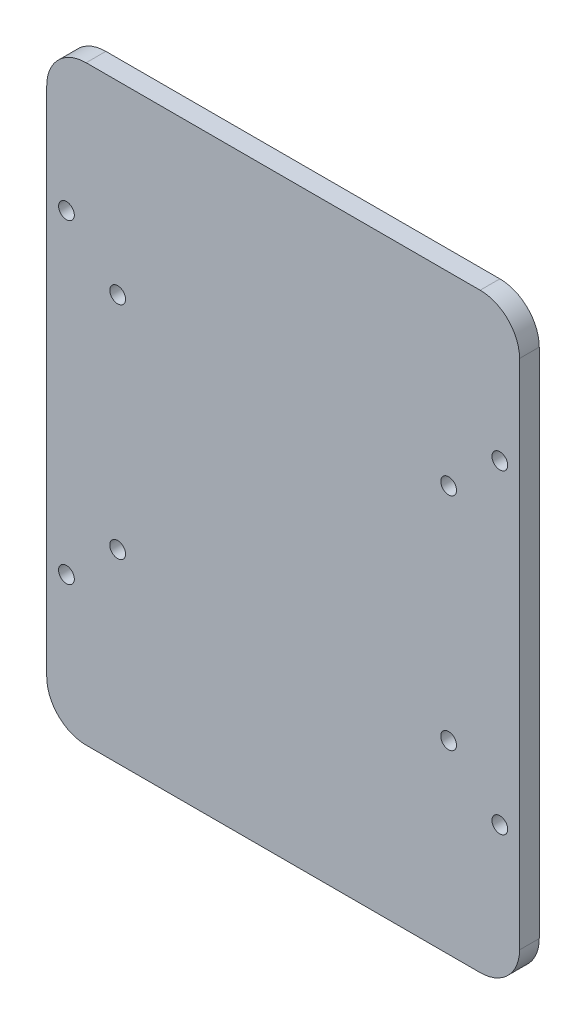
ISO-10303-21;
HEADER;
FILE_DESCRIPTION(('STEP AP214'),'2;1');
FILE_NAME('part.step','',(''),(''),'','','');
FILE_SCHEMA(('AUTOMOTIVE_DESIGN { 1 0 10303 214 1 1 1 1 }'));
ENDSEC;
DATA;
#1=APPLICATION_CONTEXT('core data for automotive mechanical design processes');
#2=APPLICATION_PROTOCOL_DEFINITION('international standard','automotive_design',2000,#1);
#3=PRODUCT_CONTEXT('',#1,'mechanical');
#4=PRODUCT('Part','Part','',(#3));
#5=PRODUCT_RELATED_PRODUCT_CATEGORY('part','',(#4));
#6=PRODUCT_DEFINITION_FORMATION('','',#4);
#7=PRODUCT_DEFINITION_CONTEXT('part definition',#1,'design');
#8=PRODUCT_DEFINITION('design','',#6,#7);
#9=PRODUCT_DEFINITION_SHAPE('','',#8);
#10=(LENGTH_UNIT() NAMED_UNIT(*) SI_UNIT(.MILLI.,.METRE.));
#11=(NAMED_UNIT(*) PLANE_ANGLE_UNIT() SI_UNIT($,.RADIAN.));
#12=(NAMED_UNIT(*) SI_UNIT($,.STERADIAN.) SOLID_ANGLE_UNIT());
#13=UNCERTAINTY_MEASURE_WITH_UNIT(LENGTH_MEASURE(1.E-05),#10,'distance_accuracy_value','');
#14=(GEOMETRIC_REPRESENTATION_CONTEXT(3) GLOBAL_UNCERTAINTY_ASSIGNED_CONTEXT((#13)) GLOBAL_UNIT_ASSIGNED_CONTEXT((#10,
#11,#12)) REPRESENTATION_CONTEXT('',''));
#15=CARTESIAN_POINT('',(0.,0.,0.));
#16=DIRECTION('',(0.,0.,1.));
#17=DIRECTION('',(1.,0.,0.));
#18=AXIS2_PLACEMENT_3D('',#15,#16,#17);
#19=CARTESIAN_POINT('',(120.,0.,5.));
#20=DIRECTION('',(0.,1.,0.));
#21=DIRECTION('',(-1.,0.,0.));
#22=AXIS2_PLACEMENT_3D('',#19,#20,#21);
#23=PLANE('',#22);
#24=DIRECTION('',(1.,0.,0.));
#25=VECTOR('',#24,1.);
#26=CARTESIAN_POINT('',(120.,0.,5.));
#27=LINE('',#26,#25);
#28=CARTESIAN_POINT('',(10.,0.,5.));
#29=VERTEX_POINT('',#28);
#30=CARTESIAN_POINT('',(110.,0.,5.));
#31=VERTEX_POINT('',#30);
#32=EDGE_CURVE('E122',#29,#31,#27,.T.);
#33=ORIENTED_EDGE('',*,*,#32,.F.);
#34=DIRECTION('',(0.,0.,-1.));
#35=VECTOR('',#34,1.);
#36=CARTESIAN_POINT('',(9.99999999999999,0.,5.));
#37=LINE('',#36,#35);
#38=CARTESIAN_POINT('',(10.,0.,0.));
#39=VERTEX_POINT('',#38);
#40=EDGE_CURVE('E107',#29,#39,#37,.T.);
#41=ORIENTED_EDGE('',*,*,#40,.T.);
#42=DIRECTION('',(1.,0.,0.));
#43=VECTOR('',#42,1.);
#44=CARTESIAN_POINT('',(120.,0.,0.));
#45=LINE('',#44,#43);
#46=CARTESIAN_POINT('',(110.,0.,0.));
#47=VERTEX_POINT('',#46);
#48=EDGE_CURVE('E119',#39,#47,#45,.T.);
#49=ORIENTED_EDGE('',*,*,#48,.T.);
#50=DIRECTION('',(0.,0.,-1.));
#51=VECTOR('',#50,1.);
#52=CARTESIAN_POINT('',(110.,0.,5.));
#53=LINE('',#52,#51);
#54=EDGE_CURVE('E124',#47,#31,#53,.F.);
#55=ORIENTED_EDGE('',*,*,#54,.T.);
#56=EDGE_LOOP('',(#33,#41,#49,#55));
#57=FACE_BOUND('',#56,.T.);
#58=ADVANCED_FACE('F35',(#57),#23,.F.);
#59=CARTESIAN_POINT('',(120.,150.,5.));
#60=DIRECTION('',(-1.,0.,0.));
#61=DIRECTION('',(0.,-1.,0.));
#62=AXIS2_PLACEMENT_3D('',#59,#60,#61);
#63=PLANE('',#62);
#64=DIRECTION('',(0.,1.,0.));
#65=VECTOR('',#64,1.);
#66=CARTESIAN_POINT('',(120.,150.,5.));
#67=LINE('',#66,#65);
#68=CARTESIAN_POINT('',(120.,10.,5.));
#69=VERTEX_POINT('',#68);
#70=CARTESIAN_POINT('',(120.,140.,5.));
#71=VERTEX_POINT('',#70);
#72=EDGE_CURVE('E211',#69,#71,#67,.T.);
#73=ORIENTED_EDGE('',*,*,#72,.F.);
#74=DIRECTION('',(0.,0.,-1.));
#75=VECTOR('',#74,1.);
#76=CARTESIAN_POINT('',(120.,10.,5.));
#77=LINE('',#76,#75);
#78=CARTESIAN_POINT('',(120.,10.,0.));
#79=VERTEX_POINT('',#78);
#80=EDGE_CURVE('E161',#69,#79,#77,.T.);
#81=ORIENTED_EDGE('',*,*,#80,.T.);
#82=DIRECTION('',(0.,1.,0.));
#83=VECTOR('',#82,1.);
#84=CARTESIAN_POINT('',(120.,150.,0.));
#85=LINE('',#84,#83);
#86=CARTESIAN_POINT('',(120.,140.,0.));
#87=VERTEX_POINT('',#86);
#88=EDGE_CURVE('E128',#79,#87,#85,.T.);
#89=ORIENTED_EDGE('',*,*,#88,.T.);
#90=DIRECTION('',(0.,0.,-1.));
#91=VECTOR('',#90,1.);
#92=CARTESIAN_POINT('',(120.,140.,5.));
#93=LINE('',#92,#91);
#94=EDGE_CURVE('E159',#87,#71,#93,.F.);
#95=ORIENTED_EDGE('',*,*,#94,.T.);
#96=EDGE_LOOP('',(#73,#81,#89,#95));
#97=FACE_BOUND('',#96,.T.);
#98=ADVANCED_FACE('F229',(#97),#63,.F.);
#99=CARTESIAN_POINT('',(0.,150.,5.));
#100=DIRECTION('',(0.,-1.,0.));
#101=DIRECTION('',(0.,0.,-1.));
#102=AXIS2_PLACEMENT_3D('',#99,#100,#101);
#103=PLANE('',#102);
#104=DIRECTION('',(-1.,0.,0.));
#105=VECTOR('',#104,1.);
#106=CARTESIAN_POINT('',(0.,150.,5.));
#107=LINE('',#106,#105);
#108=CARTESIAN_POINT('',(110.,150.,5.));
#109=VERTEX_POINT('',#108);
#110=CARTESIAN_POINT('',(10.,150.,5.));
#111=VERTEX_POINT('',#110);
#112=EDGE_CURVE('E212',#109,#111,#107,.T.);
#113=ORIENTED_EDGE('',*,*,#112,.F.);
#114=DIRECTION('',(0.,0.,-1.));
#115=VECTOR('',#114,1.);
#116=CARTESIAN_POINT('',(110.,150.,5.));
#117=LINE('',#116,#115);
#118=CARTESIAN_POINT('',(110.,150.,0.));
#119=VERTEX_POINT('',#118);
#120=EDGE_CURVE('E11',#109,#119,#117,.T.);
#121=ORIENTED_EDGE('',*,*,#120,.T.);
#122=DIRECTION('',(-1.,0.,0.));
#123=VECTOR('',#122,1.);
#124=CARTESIAN_POINT('',(0.,150.,0.));
#125=LINE('',#124,#123);
#126=CARTESIAN_POINT('',(10.,150.,0.));
#127=VERTEX_POINT('',#126);
#128=EDGE_CURVE('E132',#119,#127,#125,.T.);
#129=ORIENTED_EDGE('',*,*,#128,.T.);
#130=DIRECTION('',(0.,0.,-1.));
#131=VECTOR('',#130,1.);
#132=CARTESIAN_POINT('',(10.,150.,5.));
#133=LINE('',#132,#131);
#134=EDGE_CURVE('E44',#127,#111,#133,.F.);
#135=ORIENTED_EDGE('',*,*,#134,.T.);
#136=EDGE_LOOP('',(#113,#121,#129,#135));
#137=FACE_BOUND('',#136,.T.);
#138=ADVANCED_FACE('F222',(#137),#103,.F.);
#139=CARTESIAN_POINT('',(0.,0.,5.));
#140=DIRECTION('',(1.,0.,0.));
#141=DIRECTION('',(0.,0.,-1.));
#142=AXIS2_PLACEMENT_3D('',#139,#140,#141);
#143=PLANE('',#142);
#144=DIRECTION('',(0.,-1.,0.));
#145=VECTOR('',#144,1.);
#146=CARTESIAN_POINT('',(0.,0.,0.));
#147=LINE('',#146,#145);
#148=CARTESIAN_POINT('',(0.,140.,0.));
#149=VERTEX_POINT('',#148);
#150=CARTESIAN_POINT('',(0.,10.,0.));
#151=VERTEX_POINT('',#150);
#152=EDGE_CURVE('E142',#149,#151,#147,.T.);
#153=ORIENTED_EDGE('',*,*,#152,.T.);
#154=DIRECTION('',(0.,0.,-1.));
#155=VECTOR('',#154,1.);
#156=CARTESIAN_POINT('',(0.,10.,5.));
#157=LINE('',#156,#155);
#158=CARTESIAN_POINT('',(0.,10.,5.));
#159=VERTEX_POINT('',#158);
#160=EDGE_CURVE('E108',#151,#159,#157,.F.);
#161=ORIENTED_EDGE('',*,*,#160,.T.);
#162=DIRECTION('',(0.,-1.,0.));
#163=VECTOR('',#162,1.);
#164=CARTESIAN_POINT('',(0.,0.,5.));
#165=LINE('',#164,#163);
#166=CARTESIAN_POINT('',(0.,140.,5.));
#167=VERTEX_POINT('',#166);
#168=EDGE_CURVE('E138',#167,#159,#165,.T.);
#169=ORIENTED_EDGE('',*,*,#168,.F.);
#170=DIRECTION('',(0.,0.,-1.));
#171=VECTOR('',#170,1.);
#172=CARTESIAN_POINT('',(0.,140.,5.));
#173=LINE('',#172,#171);
#174=EDGE_CURVE('E113',#167,#149,#173,.T.);
#175=ORIENTED_EDGE('',*,*,#174,.T.);
#176=EDGE_LOOP('',(#153,#161,#169,#175));
#177=FACE_BOUND('',#176,.T.);
#178=ADVANCED_FACE('F219',(#177),#143,.F.);
#179=CARTESIAN_POINT('',(0.,0.,5.));
#180=DIRECTION('',(0.,0.,-1.));
#181=DIRECTION('',(-1.,0.,0.));
#182=AXIS2_PLACEMENT_3D('',#179,#180,#181);
#183=PLANE('',#182);
#184=CARTESIAN_POINT('',(102.,47.,5.));
#185=DIRECTION('',(0.,0.,-1.));
#186=DIRECTION('',(-1.,0.,0.));
#187=AXIS2_PLACEMENT_3D('',#184,#185,#186);
#188=CIRCLE('',#187,2.00000000000001);
#189=CARTESIAN_POINT('',(100.,47.,5.));
#190=VERTEX_POINT('',#189);
#191=EDGE_CURVE('E185',#190,#190,#188,.T.);
#192=ORIENTED_EDGE('',*,*,#191,.T.);
#193=EDGE_LOOP('',(#192));
#194=FACE_BOUND('',#193,.T.);
#195=CARTESIAN_POINT('',(115.,35.,5.));
#196=DIRECTION('',(0.,0.,-1.));
#197=DIRECTION('',(-1.,0.,0.));
#198=AXIS2_PLACEMENT_3D('',#195,#196,#197);
#199=CIRCLE('',#198,2.);
#200=CARTESIAN_POINT('',(113.,35.,5.));
#201=VERTEX_POINT('',#200);
#202=EDGE_CURVE('E191',#201,#201,#199,.T.);
#203=ORIENTED_EDGE('',*,*,#202,.T.);
#204=EDGE_LOOP('',(#203));
#205=FACE_BOUND('',#204,.T.);
#206=CARTESIAN_POINT('',(102.,103.,5.));
#207=DIRECTION('',(0.,0.,1.));
#208=DIRECTION('',(-1.,0.,0.));
#209=AXIS2_PLACEMENT_3D('',#206,#207,#208);
#210=CIRCLE('',#209,2.00000000000001);
#211=CARTESIAN_POINT('',(100.,103.,5.));
#212=VERTEX_POINT('',#211);
#213=EDGE_CURVE('E180',#212,#212,#210,.T.);
#214=ORIENTED_EDGE('',*,*,#213,.F.);
#215=EDGE_LOOP('',(#214));
#216=FACE_BOUND('',#215,.T.);
#217=CARTESIAN_POINT('',(115.,115.,5.));
#218=DIRECTION('',(0.,0.,1.));
#219=DIRECTION('',(-1.,0.,0.));
#220=AXIS2_PLACEMENT_3D('',#217,#218,#219);
#221=CIRCLE('',#220,2.);
#222=CARTESIAN_POINT('',(113.,115.,5.));
#223=VERTEX_POINT('',#222);
#224=EDGE_CURVE('E189',#223,#223,#221,.T.);
#225=ORIENTED_EDGE('',*,*,#224,.F.);
#226=EDGE_LOOP('',(#225));
#227=FACE_BOUND('',#226,.T.);
#228=CARTESIAN_POINT('',(18.,103.,5.));
#229=DIRECTION('',(0.,0.,-1.));
#230=DIRECTION('',(1.,0.,0.));
#231=AXIS2_PLACEMENT_3D('',#228,#229,#230);
#232=CIRCLE('',#231,2.00000000000001);
#233=CARTESIAN_POINT('',(20.,103.,5.));
#234=VERTEX_POINT('',#233);
#235=EDGE_CURVE('E172',#234,#234,#232,.T.);
#236=ORIENTED_EDGE('',*,*,#235,.T.);
#237=EDGE_LOOP('',(#236));
#238=FACE_BOUND('',#237,.T.);
#239=CARTESIAN_POINT('',(5.,115.,5.));
#240=DIRECTION('',(0.,0.,-1.));
#241=DIRECTION('',(1.,0.,0.));
#242=AXIS2_PLACEMENT_3D('',#239,#240,#241);
#243=CIRCLE('',#242,2.);
#244=CARTESIAN_POINT('',(7.,115.,5.));
#245=VERTEX_POINT('',#244);
#246=EDGE_CURVE('E182',#245,#245,#243,.T.);
#247=ORIENTED_EDGE('',*,*,#246,.T.);
#248=EDGE_LOOP('',(#247));
#249=FACE_BOUND('',#248,.T.);
#250=CARTESIAN_POINT('',(18.,47.,5.));
#251=DIRECTION('',(0.,0.,1.));
#252=DIRECTION('',(1.,0.,0.));
#253=AXIS2_PLACEMENT_3D('',#250,#251,#252);
#254=CIRCLE('',#253,2.00000000000001);
#255=CARTESIAN_POINT('',(20.,47.,5.));
#256=VERTEX_POINT('',#255);
#257=EDGE_CURVE('E166',#256,#256,#254,.T.);
#258=ORIENTED_EDGE('',*,*,#257,.F.);
#259=EDGE_LOOP('',(#258));
#260=FACE_BOUND('',#259,.T.);
#261=CARTESIAN_POINT('',(5.,35.,5.));
#262=DIRECTION('',(0.,0.,1.));
#263=DIRECTION('',(1.,0.,0.));
#264=AXIS2_PLACEMENT_3D('',#261,#262,#263);
#265=CIRCLE('',#264,2.);
#266=CARTESIAN_POINT('',(7.,35.,5.));
#267=VERTEX_POINT('',#266);
#268=EDGE_CURVE('E175',#267,#267,#265,.T.);
#269=ORIENTED_EDGE('',*,*,#268,.F.);
#270=EDGE_LOOP('',(#269));
#271=FACE_BOUND('',#270,.T.);
#272=ORIENTED_EDGE('',*,*,#168,.T.);
#273=CARTESIAN_POINT('',(9.99999999999999,10.,5.));
#274=DIRECTION('',(0.,0.,-1.));
#275=DIRECTION('',(-1.,0.,0.));
#276=AXIS2_PLACEMENT_3D('',#273,#274,#275);
#277=CIRCLE('',#276,10.);
#278=EDGE_CURVE('E157',#159,#29,#277,.F.);
#279=ORIENTED_EDGE('',*,*,#278,.T.);
#280=ORIENTED_EDGE('',*,*,#32,.T.);
#281=CARTESIAN_POINT('',(110.,10.,5.));
#282=DIRECTION('',(0.,0.,-1.));
#283=DIRECTION('',(-1.,0.,0.));
#284=AXIS2_PLACEMENT_3D('',#281,#282,#283);
#285=CIRCLE('',#284,10.);
#286=EDGE_CURVE('E155',#31,#69,#285,.F.);
#287=ORIENTED_EDGE('',*,*,#286,.T.);
#288=ORIENTED_EDGE('',*,*,#72,.T.);
#289=CARTESIAN_POINT('',(110.,140.,5.));
#290=DIRECTION('',(0.,0.,-1.));
#291=DIRECTION('',(-1.,0.,0.));
#292=AXIS2_PLACEMENT_3D('',#289,#290,#291);
#293=CIRCLE('',#292,10.);
#294=EDGE_CURVE('E58',#71,#109,#293,.F.);
#295=ORIENTED_EDGE('',*,*,#294,.T.);
#296=ORIENTED_EDGE('',*,*,#112,.T.);
#297=CARTESIAN_POINT('',(10.,140.,5.));
#298=DIRECTION('',(0.,0.,-1.));
#299=DIRECTION('',(-1.,0.,0.));
#300=AXIS2_PLACEMENT_3D('',#297,#298,#299);
#301=CIRCLE('',#300,10.);
#302=EDGE_CURVE('E152',#111,#167,#301,.F.);
#303=ORIENTED_EDGE('',*,*,#302,.T.);
#304=EDGE_LOOP('',(#272,#279,#280,#287,#288,#295,#296,#303));
#305=FACE_BOUND('',#304,.T.);
#306=ADVANCED_FACE('F216',(#194,#205,#216,#227,#238,#249,#260,#271,#305),#183,.F.);
#307=CARTESIAN_POINT('',(0.,0.,0.));
#308=DIRECTION('',(0.,0.,-1.));
#309=DIRECTION('',(-1.,0.,0.));
#310=AXIS2_PLACEMENT_3D('',#307,#308,#309);
#311=PLANE('',#310);
#312=CARTESIAN_POINT('',(102.,47.,0.));
#313=DIRECTION('',(0.,0.,-1.));
#314=DIRECTION('',(-1.,0.,0.));
#315=AXIS2_PLACEMENT_3D('',#312,#313,#314);
#316=CIRCLE('',#315,2.00000000000001);
#317=CARTESIAN_POINT('',(100.,47.,0.));
#318=VERTEX_POINT('',#317);
#319=EDGE_CURVE('E39',#318,#318,#316,.F.);
#320=ORIENTED_EDGE('',*,*,#319,.T.);
#321=EDGE_LOOP('',(#320));
#322=FACE_BOUND('',#321,.T.);
#323=CARTESIAN_POINT('',(115.,35.,0.));
#324=DIRECTION('',(0.,0.,-1.));
#325=DIRECTION('',(-1.,0.,0.));
#326=AXIS2_PLACEMENT_3D('',#323,#324,#325);
#327=CIRCLE('',#326,2.);
#328=CARTESIAN_POINT('',(113.,35.,0.));
#329=VERTEX_POINT('',#328);
#330=EDGE_CURVE('E183',#329,#329,#327,.F.);
#331=ORIENTED_EDGE('',*,*,#330,.T.);
#332=EDGE_LOOP('',(#331));
#333=FACE_BOUND('',#332,.T.);
#334=CARTESIAN_POINT('',(102.,103.,0.));
#335=DIRECTION('',(0.,0.,-1.));
#336=DIRECTION('',(-1.,0.,0.));
#337=AXIS2_PLACEMENT_3D('',#334,#335,#336);
#338=CIRCLE('',#337,2.00000000000001);
#339=CARTESIAN_POINT('',(100.,103.,0.));
#340=VERTEX_POINT('',#339);
#341=EDGE_CURVE('E179',#340,#340,#338,.T.);
#342=ORIENTED_EDGE('',*,*,#341,.F.);
#343=EDGE_LOOP('',(#342));
#344=FACE_BOUND('',#343,.T.);
#345=CARTESIAN_POINT('',(115.,115.,0.));
#346=DIRECTION('',(0.,0.,-1.));
#347=DIRECTION('',(-1.,0.,0.));
#348=AXIS2_PLACEMENT_3D('',#345,#346,#347);
#349=CIRCLE('',#348,2.);
#350=CARTESIAN_POINT('',(113.,115.,0.));
#351=VERTEX_POINT('',#350);
#352=EDGE_CURVE('E176',#351,#351,#349,.T.);
#353=ORIENTED_EDGE('',*,*,#352,.F.);
#354=EDGE_LOOP('',(#353));
#355=FACE_BOUND('',#354,.T.);
#356=CARTESIAN_POINT('',(18.,103.,0.));
#357=DIRECTION('',(0.,0.,-1.));
#358=DIRECTION('',(-1.,0.,0.));
#359=AXIS2_PLACEMENT_3D('',#356,#357,#358);
#360=CIRCLE('',#359,2.00000000000001);
#361=CARTESIAN_POINT('',(16.,103.,0.));
#362=VERTEX_POINT('',#361);
#363=EDGE_CURVE('E171',#362,#362,#360,.F.);
#364=ORIENTED_EDGE('',*,*,#363,.T.);
#365=EDGE_LOOP('',(#364));
#366=FACE_BOUND('',#365,.T.);
#367=CARTESIAN_POINT('',(5.,115.,0.));
#368=DIRECTION('',(0.,0.,-1.));
#369=DIRECTION('',(-1.,0.,0.));
#370=AXIS2_PLACEMENT_3D('',#367,#368,#369);
#371=CIRCLE('',#370,2.);
#372=CARTESIAN_POINT('',(3.,115.,0.));
#373=VERTEX_POINT('',#372);
#374=EDGE_CURVE('E168',#373,#373,#371,.F.);
#375=ORIENTED_EDGE('',*,*,#374,.T.);
#376=EDGE_LOOP('',(#375));
#377=FACE_BOUND('',#376,.T.);
#378=CARTESIAN_POINT('',(18.,47.,0.));
#379=DIRECTION('',(0.,0.,-1.));
#380=DIRECTION('',(-1.,0.,0.));
#381=AXIS2_PLACEMENT_3D('',#378,#379,#380);
#382=CIRCLE('',#381,2.00000000000001);
#383=CARTESIAN_POINT('',(16.,47.,0.));
#384=VERTEX_POINT('',#383);
#385=EDGE_CURVE('E129',#384,#384,#382,.T.);
#386=ORIENTED_EDGE('',*,*,#385,.F.);
#387=EDGE_LOOP('',(#386));
#388=FACE_BOUND('',#387,.T.);
#389=CARTESIAN_POINT('',(5.,35.,0.));
#390=DIRECTION('',(0.,0.,-1.));
#391=DIRECTION('',(-1.,0.,0.));
#392=AXIS2_PLACEMENT_3D('',#389,#390,#391);
#393=CIRCLE('',#392,2.);
#394=CARTESIAN_POINT('',(3.,35.,0.));
#395=VERTEX_POINT('',#394);
#396=EDGE_CURVE('E135',#395,#395,#393,.T.);
#397=ORIENTED_EDGE('',*,*,#396,.F.);
#398=EDGE_LOOP('',(#397));
#399=FACE_BOUND('',#398,.T.);
#400=ORIENTED_EDGE('',*,*,#48,.F.);
#401=CARTESIAN_POINT('',(9.99999999999999,10.,0.));
#402=DIRECTION('',(0.,0.,-1.));
#403=DIRECTION('',(-1.,0.,0.));
#404=AXIS2_PLACEMENT_3D('',#401,#402,#403);
#405=CIRCLE('',#404,10.);
#406=EDGE_CURVE('E103',#39,#151,#405,.T.);
#407=ORIENTED_EDGE('',*,*,#406,.T.);
#408=ORIENTED_EDGE('',*,*,#152,.F.);
#409=CARTESIAN_POINT('',(10.,140.,0.));
#410=DIRECTION('',(0.,0.,-1.));
#411=DIRECTION('',(-1.,0.,0.));
#412=AXIS2_PLACEMENT_3D('',#409,#410,#411);
#413=CIRCLE('',#412,10.);
#414=EDGE_CURVE('E123',#149,#127,#413,.T.);
#415=ORIENTED_EDGE('',*,*,#414,.T.);
#416=ORIENTED_EDGE('',*,*,#128,.F.);
#417=CARTESIAN_POINT('',(110.,140.,0.));
#418=DIRECTION('',(0.,0.,-1.));
#419=DIRECTION('',(-1.,0.,0.));
#420=AXIS2_PLACEMENT_3D('',#417,#418,#419);
#421=CIRCLE('',#420,10.);
#422=EDGE_CURVE('E146',#119,#87,#421,.T.);
#423=ORIENTED_EDGE('',*,*,#422,.T.);
#424=ORIENTED_EDGE('',*,*,#88,.F.);
#425=CARTESIAN_POINT('',(110.,10.,0.));
#426=DIRECTION('',(0.,0.,-1.));
#427=DIRECTION('',(-1.,0.,0.));
#428=AXIS2_PLACEMENT_3D('',#425,#426,#427);
#429=CIRCLE('',#428,10.);
#430=EDGE_CURVE('E114',#79,#47,#429,.T.);
#431=ORIENTED_EDGE('',*,*,#430,.T.);
#432=EDGE_LOOP('',(#400,#407,#408,#415,#416,#423,#424,#431));
#433=FACE_BOUND('',#432,.T.);
#434=ADVANCED_FACE('F126',(#322,#333,#344,#355,#366,#377,#388,#399,#433),#311,.T.);
#435=CARTESIAN_POINT('',(9.99999999999999,10.,5.));
#436=DIRECTION('',(0.,0.,-1.));
#437=DIRECTION('',(-1.,0.,0.));
#438=AXIS2_PLACEMENT_3D('',#435,#436,#437);
#439=CYLINDRICAL_SURFACE('',#438,10.);
#440=ORIENTED_EDGE('',*,*,#278,.F.);
#441=ORIENTED_EDGE('',*,*,#160,.F.);
#442=ORIENTED_EDGE('',*,*,#406,.F.);
#443=ORIENTED_EDGE('',*,*,#40,.F.);
#444=EDGE_LOOP('',(#440,#441,#442,#443));
#445=FACE_BOUND('',#444,.T.);
#446=ADVANCED_FACE('F106',(#445),#439,.T.);
#447=CARTESIAN_POINT('',(110.,10.,5.));
#448=DIRECTION('',(0.,0.,-1.));
#449=DIRECTION('',(-1.,0.,0.));
#450=AXIS2_PLACEMENT_3D('',#447,#448,#449);
#451=CYLINDRICAL_SURFACE('',#450,10.);
#452=ORIENTED_EDGE('',*,*,#286,.F.);
#453=ORIENTED_EDGE('',*,*,#54,.F.);
#454=ORIENTED_EDGE('',*,*,#430,.F.);
#455=ORIENTED_EDGE('',*,*,#80,.F.);
#456=EDGE_LOOP('',(#452,#453,#454,#455));
#457=FACE_BOUND('',#456,.T.);
#458=ADVANCED_FACE('F233',(#457),#451,.T.);
#459=CARTESIAN_POINT('',(110.,140.,5.));
#460=DIRECTION('',(0.,0.,-1.));
#461=DIRECTION('',(-1.,0.,0.));
#462=AXIS2_PLACEMENT_3D('',#459,#460,#461);
#463=CYLINDRICAL_SURFACE('',#462,10.);
#464=ORIENTED_EDGE('',*,*,#294,.F.);
#465=ORIENTED_EDGE('',*,*,#94,.F.);
#466=ORIENTED_EDGE('',*,*,#422,.F.);
#467=ORIENTED_EDGE('',*,*,#120,.F.);
#468=EDGE_LOOP('',(#464,#465,#466,#467));
#469=FACE_BOUND('',#468,.T.);
#470=ADVANCED_FACE('F225',(#469),#463,.T.);
#471=CARTESIAN_POINT('',(10.,140.,5.));
#472=DIRECTION('',(0.,0.,-1.));
#473=DIRECTION('',(-1.,0.,0.));
#474=AXIS2_PLACEMENT_3D('',#471,#472,#473);
#475=CYLINDRICAL_SURFACE('',#474,10.);
#476=ORIENTED_EDGE('',*,*,#302,.F.);
#477=ORIENTED_EDGE('',*,*,#134,.F.);
#478=ORIENTED_EDGE('',*,*,#414,.F.);
#479=ORIENTED_EDGE('',*,*,#174,.F.);
#480=EDGE_LOOP('',(#476,#477,#478,#479));
#481=FACE_BOUND('',#480,.T.);
#482=ADVANCED_FACE('F37',(#481),#475,.T.);
#483=CARTESIAN_POINT('',(5.,35.,-5.));
#484=DIRECTION('',(0.,0.,1.));
#485=DIRECTION('',(1.,0.,0.));
#486=AXIS2_PLACEMENT_3D('',#483,#484,#485);
#487=CYLINDRICAL_SURFACE('',#486,2.);
#488=ORIENTED_EDGE('',*,*,#396,.T.);
#489=EDGE_LOOP('',(#488));
#490=FACE_BOUND('',#489,.T.);
#491=ORIENTED_EDGE('',*,*,#268,.T.);
#492=EDGE_LOOP('',(#491));
#493=FACE_BOUND('',#492,.T.);
#494=ADVANCED_FACE('F257',(#490,#493),#487,.F.);
#495=CARTESIAN_POINT('',(18.,47.,-5.));
#496=DIRECTION('',(0.,0.,1.));
#497=DIRECTION('',(1.,0.,0.));
#498=AXIS2_PLACEMENT_3D('',#495,#496,#497);
#499=CYLINDRICAL_SURFACE('',#498,2.00000000000001);
#500=ORIENTED_EDGE('',*,*,#385,.T.);
#501=EDGE_LOOP('',(#500));
#502=FACE_BOUND('',#501,.T.);
#503=ORIENTED_EDGE('',*,*,#257,.T.);
#504=EDGE_LOOP('',(#503));
#505=FACE_BOUND('',#504,.T.);
#506=ADVANCED_FACE('F260',(#502,#505),#499,.F.);
#507=CARTESIAN_POINT('',(5.,115.,-5.));
#508=DIRECTION('',(0.,0.,1.));
#509=DIRECTION('',(1.,0.,0.));
#510=AXIS2_PLACEMENT_3D('',#507,#508,#509);
#511=CYLINDRICAL_SURFACE('',#510,2.);
#512=ORIENTED_EDGE('',*,*,#374,.F.);
#513=EDGE_LOOP('',(#512));
#514=FACE_BOUND('',#513,.T.);
#515=ORIENTED_EDGE('',*,*,#246,.F.);
#516=EDGE_LOOP('',(#515));
#517=FACE_BOUND('',#516,.T.);
#518=ADVANCED_FACE('F264',(#514,#517),#511,.F.);
#519=CARTESIAN_POINT('',(18.,103.,-5.));
#520=DIRECTION('',(0.,0.,1.));
#521=DIRECTION('',(1.,0.,0.));
#522=AXIS2_PLACEMENT_3D('',#519,#520,#521);
#523=CYLINDRICAL_SURFACE('',#522,2.00000000000001);
#524=ORIENTED_EDGE('',*,*,#363,.F.);
#525=EDGE_LOOP('',(#524));
#526=FACE_BOUND('',#525,.T.);
#527=ORIENTED_EDGE('',*,*,#235,.F.);
#528=EDGE_LOOP('',(#527));
#529=FACE_BOUND('',#528,.T.);
#530=ADVANCED_FACE('F268',(#526,#529),#523,.F.);
#531=CARTESIAN_POINT('',(115.,115.,-5.));
#532=DIRECTION('',(0.,0.,1.));
#533=DIRECTION('',(1.,0.,0.));
#534=AXIS2_PLACEMENT_3D('',#531,#532,#533);
#535=CYLINDRICAL_SURFACE('',#534,2.);
#536=ORIENTED_EDGE('',*,*,#352,.T.);
#537=EDGE_LOOP('',(#536));
#538=FACE_BOUND('',#537,.T.);
#539=ORIENTED_EDGE('',*,*,#224,.T.);
#540=EDGE_LOOP('',(#539));
#541=FACE_BOUND('',#540,.T.);
#542=ADVANCED_FACE('F272',(#538,#541),#535,.F.);
#543=CARTESIAN_POINT('',(102.,103.,-5.));
#544=DIRECTION('',(0.,0.,1.));
#545=DIRECTION('',(1.,0.,0.));
#546=AXIS2_PLACEMENT_3D('',#543,#544,#545);
#547=CYLINDRICAL_SURFACE('',#546,2.00000000000001);
#548=ORIENTED_EDGE('',*,*,#341,.T.);
#549=EDGE_LOOP('',(#548));
#550=FACE_BOUND('',#549,.T.);
#551=ORIENTED_EDGE('',*,*,#213,.T.);
#552=EDGE_LOOP('',(#551));
#553=FACE_BOUND('',#552,.T.);
#554=ADVANCED_FACE('F276',(#550,#553),#547,.F.);
#555=CARTESIAN_POINT('',(115.,35.,-5.));
#556=DIRECTION('',(0.,0.,1.));
#557=DIRECTION('',(1.,0.,0.));
#558=AXIS2_PLACEMENT_3D('',#555,#556,#557);
#559=CYLINDRICAL_SURFACE('',#558,2.);
#560=ORIENTED_EDGE('',*,*,#330,.F.);
#561=EDGE_LOOP('',(#560));
#562=FACE_BOUND('',#561,.T.);
#563=ORIENTED_EDGE('',*,*,#202,.F.);
#564=EDGE_LOOP('',(#563));
#565=FACE_BOUND('',#564,.T.);
#566=ADVANCED_FACE('F280',(#562,#565),#559,.F.);
#567=CARTESIAN_POINT('',(102.,47.,-5.));
#568=DIRECTION('',(0.,0.,1.));
#569=DIRECTION('',(1.,0.,0.));
#570=AXIS2_PLACEMENT_3D('',#567,#568,#569);
#571=CYLINDRICAL_SURFACE('',#570,2.00000000000001);
#572=ORIENTED_EDGE('',*,*,#319,.F.);
#573=EDGE_LOOP('',(#572));
#574=FACE_BOUND('',#573,.T.);
#575=ORIENTED_EDGE('',*,*,#191,.F.);
#576=EDGE_LOOP('',(#575));
#577=FACE_BOUND('',#576,.T.);
#578=ADVANCED_FACE('F284',(#574,#577),#571,.F.);
#579=CLOSED_SHELL('',(#58,#98,#138,#178,#306,#434,#446,#458,#470,#482,#494,#506,#518,#530,#542,
#554,#566,#578));
#580=MANIFOLD_SOLID_BREP('B2',#579);
#581=ADVANCED_BREP_SHAPE_REPRESENTATION('',(#18,#580),#14);
#582=SHAPE_DEFINITION_REPRESENTATION(#9,#581);
ENDSEC;
END-ISO-10303-21;
